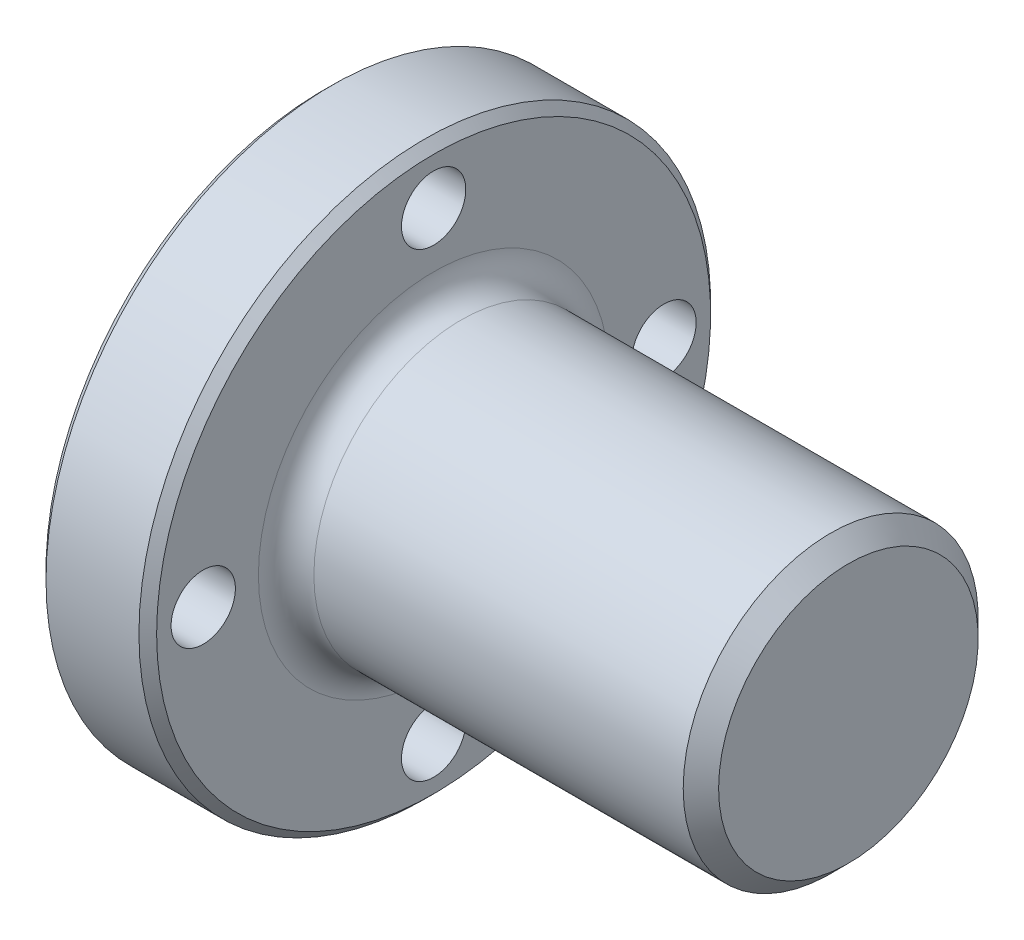
ISO-10303-21;
HEADER;
FILE_DESCRIPTION(('STEP AP214'),'2;1');
FILE_NAME('part.step','',(''),(''),'','','');
FILE_SCHEMA(('AUTOMOTIVE_DESIGN { 1 0 10303 214 1 1 1 1 }'));
ENDSEC;
DATA;
#1=APPLICATION_CONTEXT('core data for automotive mechanical design processes');
#2=APPLICATION_PROTOCOL_DEFINITION('international standard','automotive_design',2000,#1);
#3=PRODUCT_CONTEXT('',#1,'mechanical');
#4=PRODUCT('Part','Part','',(#3));
#5=PRODUCT_RELATED_PRODUCT_CATEGORY('part','',(#4));
#6=PRODUCT_DEFINITION_FORMATION('','',#4);
#7=PRODUCT_DEFINITION_CONTEXT('part definition',#1,'design');
#8=PRODUCT_DEFINITION('design','',#6,#7);
#9=PRODUCT_DEFINITION_SHAPE('','',#8);
#10=(LENGTH_UNIT() NAMED_UNIT(*) SI_UNIT(.MILLI.,.METRE.));
#11=(NAMED_UNIT(*) PLANE_ANGLE_UNIT() SI_UNIT($,.RADIAN.));
#12=(NAMED_UNIT(*) SI_UNIT($,.STERADIAN.) SOLID_ANGLE_UNIT());
#13=UNCERTAINTY_MEASURE_WITH_UNIT(LENGTH_MEASURE(1.E-05),#10,'distance_accuracy_value','');
#14=(GEOMETRIC_REPRESENTATION_CONTEXT(3) GLOBAL_UNCERTAINTY_ASSIGNED_CONTEXT((#13)) GLOBAL_UNIT_ASSIGNED_CONTEXT((#10,
#11,#12)) REPRESENTATION_CONTEXT('',''));
#15=CARTESIAN_POINT('',(0.,0.,0.));
#16=DIRECTION('',(0.,0.,1.));
#17=DIRECTION('',(1.,0.,0.));
#18=AXIS2_PLACEMENT_3D('',#15,#16,#17);
#19=CARTESIAN_POINT('',(0.,0.,0.));
#20=DIRECTION('',(1.,0.,0.));
#21=DIRECTION('',(0.,0.,-1.));
#22=AXIS2_PLACEMENT_3D('',#19,#20,#21);
#23=PLANE('',#22);
#24=CARTESIAN_POINT('',(0.,0.,0.));
#25=DIRECTION('',(-1.,0.,0.));
#26=DIRECTION('',(0.,0.,1.));
#27=AXIS2_PLACEMENT_3D('',#24,#25,#26);
#28=CIRCLE('',#27,8.7122);
#29=CARTESIAN_POINT('',(0.,0.,8.7122));
#30=VERTEX_POINT('',#29);
#31=EDGE_CURVE('E76',#30,#30,#28,.T.);
#32=ORIENTED_EDGE('',*,*,#31,.T.);
#33=EDGE_LOOP('',(#32));
#34=FACE_BOUND('',#33,.T.);
#35=ADVANCED_FACE('F43',(#34),#23,.F.);
#36=CARTESIAN_POINT('',(-25.4,0.,0.));
#37=DIRECTION('',(-1.,0.,0.));
#38=DIRECTION('',(0.,0.,1.));
#39=AXIS2_PLACEMENT_3D('',#36,#37,#38);
#40=CYLINDRICAL_SURFACE('',#39,8.7122);
#41=ORIENTED_EDGE('',*,*,#31,.F.);
#42=EDGE_LOOP('',(#41));
#43=FACE_BOUND('',#42,.T.);
#44=CARTESIAN_POINT('',(4.826,0.,0.));
#45=DIRECTION('',(-1.,0.,0.));
#46=DIRECTION('',(0.,0.,1.));
#47=AXIS2_PLACEMENT_3D('',#44,#45,#46);
#48=CIRCLE('',#47,8.7122);
#49=CARTESIAN_POINT('',(4.826,0.,8.7122));
#50=VERTEX_POINT('',#49);
#51=EDGE_CURVE('E91',#50,#50,#48,.T.);
#52=ORIENTED_EDGE('',*,*,#51,.T.);
#53=EDGE_LOOP('',(#52));
#54=FACE_BOUND('',#53,.T.);
#55=ADVANCED_FACE('F147',(#43,#54),#40,.T.);
#56=CARTESIAN_POINT('',(4.826,8.7122,0.));
#57=DIRECTION('',(1.,0.,0.));
#58=DIRECTION('',(0.,0.,-1.));
#59=AXIS2_PLACEMENT_3D('',#56,#57,#58);
#60=PLANE('',#59);
#61=CARTESIAN_POINT('',(4.826,0.,0.));
#62=DIRECTION('',(1.,0.,0.));
#63=DIRECTION('',(0.,0.,-1.));
#64=AXIS2_PLACEMENT_3D('',#61,#62,#63);
#65=CIRCLE('',#64,23.8506);
#66=CARTESIAN_POINT('',(4.826,0.,-23.8506));
#67=VERTEX_POINT('',#66);
#68=EDGE_CURVE('E55',#67,#67,#65,.F.);
#69=ORIENTED_EDGE('',*,*,#68,.T.);
#70=EDGE_LOOP('',(#69));
#71=FACE_BOUND('',#70,.T.);
#72=CARTESIAN_POINT('',(4.826,0.,19.8374));
#73=DIRECTION('',(1.,0.,0.));
#74=DIRECTION('',(0.,0.,-1.));
#75=AXIS2_PLACEMENT_3D('',#72,#73,#74);
#76=CIRCLE('',#75,2.7686);
#77=CARTESIAN_POINT('',(4.826,0.,17.0688));
#78=VERTEX_POINT('',#77);
#79=EDGE_CURVE('E87',#78,#78,#76,.T.);
#80=ORIENTED_EDGE('',*,*,#79,.T.);
#81=EDGE_LOOP('',(#80));
#82=FACE_BOUND('',#81,.T.);
#83=CARTESIAN_POINT('',(4.826,-19.8374,0.));
#84=DIRECTION('',(1.,0.,0.));
#85=DIRECTION('',(0.,0.,-1.));
#86=AXIS2_PLACEMENT_3D('',#83,#84,#85);
#87=CIRCLE('',#86,2.7686);
#88=CARTESIAN_POINT('',(4.826,-19.8374,-2.7686));
#89=VERTEX_POINT('',#88);
#90=EDGE_CURVE('E101',#89,#89,#87,.T.);
#91=ORIENTED_EDGE('',*,*,#90,.T.);
#92=EDGE_LOOP('',(#91));
#93=FACE_BOUND('',#92,.T.);
#94=CARTESIAN_POINT('',(4.826,0.,-19.8374));
#95=DIRECTION('',(1.,0.,0.));
#96=DIRECTION('',(0.,0.,-1.));
#97=AXIS2_PLACEMENT_3D('',#94,#95,#96);
#98=CIRCLE('',#97,2.7686);
#99=CARTESIAN_POINT('',(4.826,0.,-22.606));
#100=VERTEX_POINT('',#99);
#101=EDGE_CURVE('E98',#100,#100,#98,.T.);
#102=ORIENTED_EDGE('',*,*,#101,.T.);
#103=EDGE_LOOP('',(#102));
#104=FACE_BOUND('',#103,.T.);
#105=CARTESIAN_POINT('',(4.826,19.8374,0.));
#106=DIRECTION('',(1.,0.,0.));
#107=DIRECTION('',(0.,0.,-1.));
#108=AXIS2_PLACEMENT_3D('',#105,#106,#107);
#109=CIRCLE('',#108,2.7686);
#110=CARTESIAN_POINT('',(4.826,19.8374,-2.7686));
#111=VERTEX_POINT('',#110);
#112=EDGE_CURVE('E80',#111,#111,#109,.T.);
#113=ORIENTED_EDGE('',*,*,#112,.T.);
#114=EDGE_LOOP('',(#113));
#115=FACE_BOUND('',#114,.T.);
#116=ORIENTED_EDGE('',*,*,#51,.F.);
#117=EDGE_LOOP('',(#116));
#118=FACE_BOUND('',#117,.T.);
#119=ADVANCED_FACE('F107',(#71,#82,#93,#104,#115,#118),#60,.F.);
#120=CARTESIAN_POINT('',(-25.4,0.,0.));
#121=DIRECTION('',(-1.,0.,0.));
#122=DIRECTION('',(0.,0.,1.));
#123=AXIS2_PLACEMENT_3D('',#120,#121,#122);
#124=CYLINDRICAL_SURFACE('',#123,24.6126);
#125=CARTESIAN_POINT('',(13.589,0.,0.));
#126=DIRECTION('',(-1.,0.,0.));
#127=DIRECTION('',(0.,0.,1.));
#128=AXIS2_PLACEMENT_3D('',#125,#126,#127);
#129=CIRCLE('',#128,24.6126);
#130=CARTESIAN_POINT('',(13.589,0.,24.6126));
#131=VERTEX_POINT('',#130);
#132=EDGE_CURVE('E64',#131,#131,#129,.T.);
#133=ORIENTED_EDGE('',*,*,#132,.T.);
#134=EDGE_LOOP('',(#133));
#135=FACE_BOUND('',#134,.T.);
#136=CARTESIAN_POINT('',(5.58800000000002,0.,0.));
#137=DIRECTION('',(1.,0.,0.));
#138=DIRECTION('',(0.,0.,-1.));
#139=AXIS2_PLACEMENT_3D('',#136,#137,#138);
#140=CIRCLE('',#139,24.6126);
#141=CARTESIAN_POINT('',(5.58800000000002,0.,-24.6126));
#142=VERTEX_POINT('',#141);
#143=EDGE_CURVE('E67',#142,#142,#140,.T.);
#144=ORIENTED_EDGE('',*,*,#143,.T.);
#145=EDGE_LOOP('',(#144));
#146=FACE_BOUND('',#145,.T.);
#147=ADVANCED_FACE('F122',(#135,#146),#124,.T.);
#148=CARTESIAN_POINT('',(14.351,24.6126,0.));
#149=DIRECTION('',(-1.,0.,0.));
#150=DIRECTION('',(0.,0.,1.));
#151=AXIS2_PLACEMENT_3D('',#148,#149,#150);
#152=PLANE('',#151);
#153=CARTESIAN_POINT('',(14.351,0.,0.));
#154=DIRECTION('',(-1.,0.,0.));
#155=DIRECTION('',(0.,0.,1.));
#156=AXIS2_PLACEMENT_3D('',#153,#154,#155);
#157=CIRCLE('',#156,23.8506);
#158=CARTESIAN_POINT('',(14.351,0.,23.8506));
#159=VERTEX_POINT('',#158);
#160=EDGE_CURVE('E59',#159,#159,#157,.F.);
#161=ORIENTED_EDGE('',*,*,#160,.T.);
#162=EDGE_LOOP('',(#161));
#163=FACE_BOUND('',#162,.T.);
#164=CARTESIAN_POINT('',(14.351,0.,0.));
#165=DIRECTION('',(-1.,0.,0.));
#166=DIRECTION('',(0.,0.,1.));
#167=AXIS2_PLACEMENT_3D('',#164,#165,#166);
#168=CIRCLE('',#167,15.0876);
#169=CARTESIAN_POINT('',(14.351,0.,15.0876));
#170=VERTEX_POINT('',#169);
#171=EDGE_CURVE('E73',#170,#170,#168,.T.);
#172=ORIENTED_EDGE('',*,*,#171,.T.);
#173=EDGE_LOOP('',(#172));
#174=FACE_BOUND('',#173,.T.);
#175=CARTESIAN_POINT('',(14.351,0.,19.8374));
#176=DIRECTION('',(-1.,0.,0.));
#177=DIRECTION('',(0.,0.,1.));
#178=AXIS2_PLACEMENT_3D('',#175,#176,#177);
#179=CIRCLE('',#178,2.7686);
#180=CARTESIAN_POINT('',(14.351,0.,22.606));
#181=VERTEX_POINT('',#180);
#182=EDGE_CURVE('E77',#181,#181,#179,.F.);
#183=ORIENTED_EDGE('',*,*,#182,.F.);
#184=EDGE_LOOP('',(#183));
#185=FACE_BOUND('',#184,.T.);
#186=CARTESIAN_POINT('',(14.351,-19.8374,0.));
#187=DIRECTION('',(-1.,0.,0.));
#188=DIRECTION('',(0.,0.,1.));
#189=AXIS2_PLACEMENT_3D('',#186,#187,#188);
#190=CIRCLE('',#189,2.7686);
#191=CARTESIAN_POINT('',(14.351,-19.8374,2.7686));
#192=VERTEX_POINT('',#191);
#193=EDGE_CURVE('E81',#192,#192,#190,.F.);
#194=ORIENTED_EDGE('',*,*,#193,.F.);
#195=EDGE_LOOP('',(#194));
#196=FACE_BOUND('',#195,.T.);
#197=CARTESIAN_POINT('',(14.351,0.,-19.8374));
#198=DIRECTION('',(-1.,0.,0.));
#199=DIRECTION('',(0.,0.,1.));
#200=AXIS2_PLACEMENT_3D('',#197,#198,#199);
#201=CIRCLE('',#200,2.7686);
#202=CARTESIAN_POINT('',(14.351,0.,-17.0688));
#203=VERTEX_POINT('',#202);
#204=EDGE_CURVE('E84',#203,#203,#201,.F.);
#205=ORIENTED_EDGE('',*,*,#204,.F.);
#206=EDGE_LOOP('',(#205));
#207=FACE_BOUND('',#206,.T.);
#208=CARTESIAN_POINT('',(14.351,19.8374,0.));
#209=DIRECTION('',(-1.,0.,0.));
#210=DIRECTION('',(0.,0.,1.));
#211=AXIS2_PLACEMENT_3D('',#208,#209,#210);
#212=CIRCLE('',#211,2.7686);
#213=CARTESIAN_POINT('',(14.351,19.8374,2.7686));
#214=VERTEX_POINT('',#213);
#215=EDGE_CURVE('E88',#214,#214,#212,.F.);
#216=ORIENTED_EDGE('',*,*,#215,.F.);
#217=EDGE_LOOP('',(#216));
#218=FACE_BOUND('',#217,.T.);
#219=ADVANCED_FACE('F118',(#163,#174,#185,#196,#207,#218),#152,.F.);
#220=CARTESIAN_POINT('',(-25.4,0.,0.));
#221=DIRECTION('',(-1.,0.,0.));
#222=DIRECTION('',(0.,0.,1.));
#223=AXIS2_PLACEMENT_3D('',#220,#221,#222);
#224=CYLINDRICAL_SURFACE('',#223,12.7);
#225=CARTESIAN_POINT('',(48.5394,0.,0.));
#226=DIRECTION('',(-1.,0.,0.));
#227=DIRECTION('',(0.,0.,1.));
#228=AXIS2_PLACEMENT_3D('',#225,#226,#227);
#229=CIRCLE('',#228,12.7);
#230=CARTESIAN_POINT('',(48.5394,0.,12.7));
#231=VERTEX_POINT('',#230);
#232=EDGE_CURVE('E51',#231,#231,#229,.T.);
#233=ORIENTED_EDGE('',*,*,#232,.T.);
#234=EDGE_LOOP('',(#233));
#235=FACE_BOUND('',#234,.T.);
#236=CARTESIAN_POINT('',(16.7386,0.,0.));
#237=DIRECTION('',(-1.,0.,0.));
#238=DIRECTION('',(0.,0.,1.));
#239=AXIS2_PLACEMENT_3D('',#236,#237,#238);
#240=CIRCLE('',#239,12.7);
#241=CARTESIAN_POINT('',(16.7386,0.,12.7));
#242=VERTEX_POINT('',#241);
#243=EDGE_CURVE('E70',#242,#242,#240,.F.);
#244=ORIENTED_EDGE('',*,*,#243,.T.);
#245=EDGE_LOOP('',(#244));
#246=FACE_BOUND('',#245,.T.);
#247=ADVANCED_FACE('F121',(#235,#246),#224,.T.);
#248=CARTESIAN_POINT('',(50.0634,12.7,0.));
#249=DIRECTION('',(-1.,0.,0.));
#250=DIRECTION('',(0.,0.,1.));
#251=AXIS2_PLACEMENT_3D('',#248,#249,#250);
#252=PLANE('',#251);
#253=CARTESIAN_POINT('',(50.0634,0.,0.));
#254=DIRECTION('',(-1.,0.,0.));
#255=DIRECTION('',(0.,0.,1.));
#256=AXIS2_PLACEMENT_3D('',#253,#254,#255);
#257=CIRCLE('',#256,11.176);
#258=CARTESIAN_POINT('',(50.0634,0.,11.176));
#259=VERTEX_POINT('',#258);
#260=EDGE_CURVE('E10',#259,#259,#257,.F.);
#261=ORIENTED_EDGE('',*,*,#260,.T.);
#262=EDGE_LOOP('',(#261));
#263=FACE_BOUND('',#262,.T.);
#264=ADVANCED_FACE('F134',(#263),#252,.F.);
#265=CARTESIAN_POINT('',(50.0634,19.8374,0.));
#266=DIRECTION('',(-1.,0.,0.));
#267=DIRECTION('',(0.,0.,1.));
#268=AXIS2_PLACEMENT_3D('',#265,#266,#267);
#269=CYLINDRICAL_SURFACE('',#268,2.7686);
#270=ORIENTED_EDGE('',*,*,#112,.F.);
#271=EDGE_LOOP('',(#270));
#272=FACE_BOUND('',#271,.T.);
#273=ORIENTED_EDGE('',*,*,#215,.T.);
#274=EDGE_LOOP('',(#273));
#275=FACE_BOUND('',#274,.T.);
#276=ADVANCED_FACE('F131',(#272,#275),#269,.F.);
#277=CARTESIAN_POINT('',(50.0634,0.,-19.8374));
#278=DIRECTION('',(-1.,0.,0.));
#279=DIRECTION('',(0.,0.,1.));
#280=AXIS2_PLACEMENT_3D('',#277,#278,#279);
#281=CYLINDRICAL_SURFACE('',#280,2.7686);
#282=ORIENTED_EDGE('',*,*,#101,.F.);
#283=EDGE_LOOP('',(#282));
#284=FACE_BOUND('',#283,.T.);
#285=ORIENTED_EDGE('',*,*,#204,.T.);
#286=EDGE_LOOP('',(#285));
#287=FACE_BOUND('',#286,.T.);
#288=ADVANCED_FACE('F133',(#284,#287),#281,.F.);
#289=CARTESIAN_POINT('',(50.0634,-19.8374,0.));
#290=DIRECTION('',(-1.,0.,0.));
#291=DIRECTION('',(0.,0.,1.));
#292=AXIS2_PLACEMENT_3D('',#289,#290,#291);
#293=CYLINDRICAL_SURFACE('',#292,2.7686);
#294=ORIENTED_EDGE('',*,*,#90,.F.);
#295=EDGE_LOOP('',(#294));
#296=FACE_BOUND('',#295,.T.);
#297=ORIENTED_EDGE('',*,*,#193,.T.);
#298=EDGE_LOOP('',(#297));
#299=FACE_BOUND('',#298,.T.);
#300=ADVANCED_FACE('F114',(#296,#299),#293,.F.);
#301=CARTESIAN_POINT('',(50.0634,0.,19.8374));
#302=DIRECTION('',(-1.,0.,0.));
#303=DIRECTION('',(0.,0.,1.));
#304=AXIS2_PLACEMENT_3D('',#301,#302,#303);
#305=CYLINDRICAL_SURFACE('',#304,2.7686);
#306=ORIENTED_EDGE('',*,*,#79,.F.);
#307=EDGE_LOOP('',(#306));
#308=FACE_BOUND('',#307,.T.);
#309=ORIENTED_EDGE('',*,*,#182,.T.);
#310=EDGE_LOOP('',(#309));
#311=FACE_BOUND('',#310,.T.);
#312=ADVANCED_FACE('F110',(#308,#311),#305,.F.);
#313=CARTESIAN_POINT('',(16.7386,0.,0.));
#314=DIRECTION('',(-1.,0.,0.));
#315=DIRECTION('',(0.,0.,1.));
#316=AXIS2_PLACEMENT_3D('',#313,#314,#315);
#317=TOROIDAL_SURFACE('',#316,15.0876,2.3876);
#318=ORIENTED_EDGE('',*,*,#243,.F.);
#319=EDGE_LOOP('',(#318));
#320=FACE_BOUND('',#319,.T.);
#321=ORIENTED_EDGE('',*,*,#171,.F.);
#322=EDGE_LOOP('',(#321));
#323=FACE_BOUND('',#322,.T.);
#324=ADVANCED_FACE('F113',(#320,#323),#317,.F.);
#325=CARTESIAN_POINT('',(13.589,0.,0.));
#326=DIRECTION('',(-1.,0.,0.));
#327=DIRECTION('',(0.,0.,1.));
#328=AXIS2_PLACEMENT_3D('',#325,#326,#327);
#329=CONICAL_SURFACE('',#328,24.6126,0.785398163397457);
#330=ORIENTED_EDGE('',*,*,#160,.F.);
#331=EDGE_LOOP('',(#330));
#332=FACE_BOUND('',#331,.T.);
#333=ORIENTED_EDGE('',*,*,#132,.F.);
#334=EDGE_LOOP('',(#333));
#335=FACE_BOUND('',#334,.T.);
#336=ADVANCED_FACE('F158',(#332,#335),#329,.T.);
#337=CARTESIAN_POINT('',(4.826,0.,0.));
#338=DIRECTION('',(1.,0.,0.));
#339=DIRECTION('',(0.,0.,-1.));
#340=AXIS2_PLACEMENT_3D('',#337,#338,#339);
#341=CONICAL_SURFACE('',#340,23.8506,0.785398163397432);
#342=ORIENTED_EDGE('',*,*,#143,.F.);
#343=EDGE_LOOP('',(#342));
#344=FACE_BOUND('',#343,.T.);
#345=ORIENTED_EDGE('',*,*,#68,.F.);
#346=EDGE_LOOP('',(#345));
#347=FACE_BOUND('',#346,.T.);
#348=ADVANCED_FACE('F165',(#344,#347),#341,.T.);
#349=CARTESIAN_POINT('',(48.5394,0.,0.));
#350=DIRECTION('',(-1.,0.,0.));
#351=DIRECTION('',(0.,0.,1.));
#352=AXIS2_PLACEMENT_3D('',#349,#350,#351);
#353=CONICAL_SURFACE('',#352,12.7,0.785398163397452);
#354=ORIENTED_EDGE('',*,*,#260,.F.);
#355=EDGE_LOOP('',(#354));
#356=FACE_BOUND('',#355,.T.);
#357=ORIENTED_EDGE('',*,*,#232,.F.);
#358=EDGE_LOOP('',(#357));
#359=FACE_BOUND('',#358,.T.);
#360=ADVANCED_FACE('F46',(#356,#359),#353,.T.);
#361=CLOSED_SHELL('',(#35,#55,#119,#147,#219,#247,#264,#276,#288,#300,#312,#324,#336,#348,#360));
#362=MANIFOLD_SOLID_BREP('B2',#361);
#363=ADVANCED_BREP_SHAPE_REPRESENTATION('',(#18,#362),#14);
#364=SHAPE_DEFINITION_REPRESENTATION(#9,#363);
ENDSEC;
END-ISO-10303-21;
